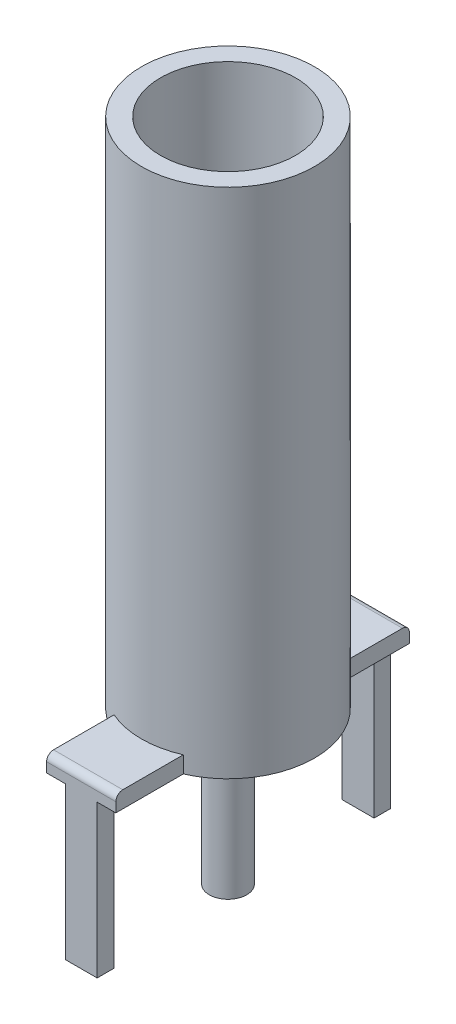
ISO-10303-21;
HEADER;
FILE_DESCRIPTION(('STEP AP214'),'2;1');
FILE_NAME('part.step','',(''),(''),'','','');
FILE_SCHEMA(('AUTOMOTIVE_DESIGN { 1 0 10303 214 1 1 1 1 }'));
ENDSEC;
DATA;
#1=APPLICATION_CONTEXT('core data for automotive mechanical design processes');
#2=APPLICATION_PROTOCOL_DEFINITION('international standard','automotive_design',2000,#1);
#3=PRODUCT_CONTEXT('',#1,'mechanical');
#4=PRODUCT('Part','Part','',(#3));
#5=PRODUCT_RELATED_PRODUCT_CATEGORY('part','',(#4));
#6=PRODUCT_DEFINITION_FORMATION('','',#4);
#7=PRODUCT_DEFINITION_CONTEXT('part definition',#1,'design');
#8=PRODUCT_DEFINITION('design','',#6,#7);
#9=PRODUCT_DEFINITION_SHAPE('','',#8);
#10=(LENGTH_UNIT() NAMED_UNIT(*) SI_UNIT(.MILLI.,.METRE.));
#11=(NAMED_UNIT(*) PLANE_ANGLE_UNIT() SI_UNIT($,.RADIAN.));
#12=(NAMED_UNIT(*) SI_UNIT($,.STERADIAN.) SOLID_ANGLE_UNIT());
#13=UNCERTAINTY_MEASURE_WITH_UNIT(LENGTH_MEASURE(1.E-05),#10,'distance_accuracy_value','');
#14=(GEOMETRIC_REPRESENTATION_CONTEXT(3) GLOBAL_UNCERTAINTY_ASSIGNED_CONTEXT((#13)) GLOBAL_UNIT_ASSIGNED_CONTEXT((#10,
#11,#12)) REPRESENTATION_CONTEXT('',''));
#15=CARTESIAN_POINT('',(0.,0.,0.));
#16=DIRECTION('',(0.,0.,1.));
#17=DIRECTION('',(1.,0.,0.));
#18=AXIS2_PLACEMENT_3D('',#15,#16,#17);
#19=CARTESIAN_POINT('',(0.,0.,0.));
#20=DIRECTION('',(0.,1.,0.));
#21=DIRECTION('',(0.,0.,1.));
#22=AXIS2_PLACEMENT_3D('',#19,#20,#21);
#23=PLANE('',#22);
#24=CARTESIAN_POINT('',(0.,0.,0.));
#25=DIRECTION('',(0.,1.,0.));
#26=DIRECTION('',(0.,0.,1.));
#27=AXIS2_PLACEMENT_3D('',#24,#25,#26);
#28=CIRCLE('',#27,0.3429);
#29=CARTESIAN_POINT('',(0.,0.,0.3429));
#30=VERTEX_POINT('',#29);
#31=EDGE_CURVE('E341',#30,#30,#28,.F.);
#32=ORIENTED_EDGE('',*,*,#31,.F.);
#33=EDGE_LOOP('',(#32));
#34=FACE_BOUND('',#33,.T.);
#35=DIRECTION('',(0.,0.,-1.));
#36=VECTOR('',#35,1.);
#37=CARTESIAN_POINT('',(-0.2921,0.,2.3876));
#38=LINE('',#37,#36);
#39=CARTESIAN_POINT('',(-0.2921,0.,2.6924));
#40=VERTEX_POINT('',#39);
#41=CARTESIAN_POINT('',(-0.2921,0.,2.3876));
#42=VERTEX_POINT('',#41);
#43=EDGE_CURVE('E227',#40,#42,#38,.T.);
#44=ORIENTED_EDGE('',*,*,#43,.F.);
#45=DIRECTION('',(-1.,0.,0.));
#46=VECTOR('',#45,1.);
#47=CARTESIAN_POINT('',(-0.635,0.,2.6924));
#48=LINE('',#47,#46);
#49=CARTESIAN_POINT('',(-0.635,0.,2.6924));
#50=VERTEX_POINT('',#49);
#51=EDGE_CURVE('E301',#40,#50,#48,.T.);
#52=ORIENTED_EDGE('',*,*,#51,.T.);
#53=DIRECTION('',(0.,0.,-1.));
#54=VECTOR('',#53,1.);
#55=CARTESIAN_POINT('',(-0.635,0.,2.6924));
#56=LINE('',#55,#54);
#57=CARTESIAN_POINT('',(-0.635,0.,1.45496778314848));
#58=VERTEX_POINT('',#57);
#59=EDGE_CURVE('E288',#50,#58,#56,.T.);
#60=ORIENTED_EDGE('',*,*,#59,.T.);
#61=CARTESIAN_POINT('',(0.,0.,0.));
#62=DIRECTION('',(0.,1.,0.));
#63=DIRECTION('',(0.,0.,1.));
#64=AXIS2_PLACEMENT_3D('',#61,#62,#63);
#65=CIRCLE('',#64,1.5875);
#66=CARTESIAN_POINT('',(-0.634999999999999,0.,-1.45496778314848));
#67=VERTEX_POINT('',#66);
#68=EDGE_CURVE('E336',#67,#58,#65,.T.);
#69=ORIENTED_EDGE('',*,*,#68,.F.);
#70=CARTESIAN_POINT('',(-0.634999999999999,0.,-2.6924));
#71=VERTEX_POINT('',#70);
#72=EDGE_CURVE('E278',#67,#71,#56,.T.);
#73=ORIENTED_EDGE('',*,*,#72,.T.);
#74=DIRECTION('',(1.,0.,0.));
#75=VECTOR('',#74,1.);
#76=CARTESIAN_POINT('',(-0.634999999999999,0.,-2.6924));
#77=LINE('',#76,#75);
#78=CARTESIAN_POINT('',(-0.2921,0.,-2.6924));
#79=VERTEX_POINT('',#78);
#80=EDGE_CURVE('E293',#71,#79,#77,.T.);
#81=ORIENTED_EDGE('',*,*,#80,.T.);
#82=DIRECTION('',(0.,0.,-1.));
#83=VECTOR('',#82,1.);
#84=CARTESIAN_POINT('',(-0.2921,0.,-2.3876));
#85=LINE('',#84,#83);
#86=CARTESIAN_POINT('',(-0.2921,0.,-2.3876));
#87=VERTEX_POINT('',#86);
#88=EDGE_CURVE('E229',#87,#79,#85,.T.);
#89=ORIENTED_EDGE('',*,*,#88,.F.);
#90=DIRECTION('',(-1.,0.,0.));
#91=VECTOR('',#90,1.);
#92=CARTESIAN_POINT('',(-0.2921,0.,-2.3876));
#93=LINE('',#92,#91);
#94=CARTESIAN_POINT('',(0.2921,0.,-2.3876));
#95=VERTEX_POINT('',#94);
#96=EDGE_CURVE('E247',#95,#87,#93,.T.);
#97=ORIENTED_EDGE('',*,*,#96,.F.);
#98=DIRECTION('',(0.,0.,1.));
#99=VECTOR('',#98,1.);
#100=CARTESIAN_POINT('',(0.2921,0.,-2.3876));
#101=LINE('',#100,#99);
#102=CARTESIAN_POINT('',(0.2921,0.,-2.6924));
#103=VERTEX_POINT('',#102);
#104=EDGE_CURVE('E235',#103,#95,#101,.T.);
#105=ORIENTED_EDGE('',*,*,#104,.F.);
#106=CARTESIAN_POINT('',(0.635000000000001,0.,-2.6924));
#107=VERTEX_POINT('',#106);
#108=EDGE_CURVE('E292',#103,#107,#77,.T.);
#109=ORIENTED_EDGE('',*,*,#108,.T.);
#110=DIRECTION('',(0.,0.,1.));
#111=VECTOR('',#110,1.);
#112=CARTESIAN_POINT('',(0.635000000000001,0.,2.6924));
#113=LINE('',#112,#111);
#114=CARTESIAN_POINT('',(0.635000000000001,0.,-1.45496778314848));
#115=VERTEX_POINT('',#114);
#116=EDGE_CURVE('E297',#107,#115,#113,.T.);
#117=ORIENTED_EDGE('',*,*,#116,.T.);
#118=CARTESIAN_POINT('',(0.635000000000001,0.,1.45496778314848));
#119=VERTEX_POINT('',#118);
#120=EDGE_CURVE('E342',#119,#115,#65,.T.);
#121=ORIENTED_EDGE('',*,*,#120,.F.);
#122=CARTESIAN_POINT('',(0.635000000000001,0.,2.6924));
#123=VERTEX_POINT('',#122);
#124=EDGE_CURVE('E296',#119,#123,#113,.T.);
#125=ORIENTED_EDGE('',*,*,#124,.T.);
#126=CARTESIAN_POINT('',(0.2921,0.,2.6924));
#127=VERTEX_POINT('',#126);
#128=EDGE_CURVE('E302',#123,#127,#48,.T.);
#129=ORIENTED_EDGE('',*,*,#128,.T.);
#130=DIRECTION('',(0.,0.,1.));
#131=VECTOR('',#130,1.);
#132=CARTESIAN_POINT('',(0.292100000000001,0.,2.3876));
#133=LINE('',#132,#131);
#134=CARTESIAN_POINT('',(0.292100000000001,0.,2.3876));
#135=VERTEX_POINT('',#134);
#136=EDGE_CURVE('E223',#135,#127,#133,.T.);
#137=ORIENTED_EDGE('',*,*,#136,.F.);
#138=DIRECTION('',(1.,0.,0.));
#139=VECTOR('',#138,1.);
#140=CARTESIAN_POINT('',(-0.2921,0.,2.3876));
#141=LINE('',#140,#139);
#142=EDGE_CURVE('E422',#42,#135,#141,.T.);
#143=ORIENTED_EDGE('',*,*,#142,.F.);
#144=EDGE_LOOP('',(#44,#52,#60,#69,#73,#81,#89,#97,#105,#109,#117,#121,#125,#129,#137,#143));
#145=FACE_BOUND('',#144,.T.);
#146=ADVANCED_FACE('F39',(#34,#145),#23,.F.);
#147=CARTESIAN_POINT('',(0.,9.398,0.));
#148=DIRECTION('',(0.,-1.,0.));
#149=DIRECTION('',(0.,0.,-1.));
#150=AXIS2_PLACEMENT_3D('',#147,#148,#149);
#151=CYLINDRICAL_SURFACE('',#150,1.5875);
#152=ORIENTED_EDGE('',*,*,#68,.T.);
#153=DIRECTION('',(0.,-1.,0.));
#154=VECTOR('',#153,1.);
#155=CARTESIAN_POINT('',(-0.635,9.398,1.45496778314848));
#156=LINE('',#155,#154);
#157=CARTESIAN_POINT('',(-0.635,0.304799999999999,1.45496778314848));
#158=VERTEX_POINT('',#157);
#159=EDGE_CURVE('E324',#58,#158,#156,.F.);
#160=ORIENTED_EDGE('',*,*,#159,.T.);
#161=CARTESIAN_POINT('',(0.,0.304799999999999,0.));
#162=DIRECTION('',(0.,-1.,0.));
#163=DIRECTION('',(0.,0.,-1.));
#164=AXIS2_PLACEMENT_3D('',#161,#162,#163);
#165=CIRCLE('',#164,1.5875);
#166=CARTESIAN_POINT('',(0.635000000000001,0.304799999999999,1.45496778314848));
#167=VERTEX_POINT('',#166);
#168=EDGE_CURVE('E352',#167,#158,#165,.T.);
#169=ORIENTED_EDGE('',*,*,#168,.F.);
#170=DIRECTION('',(0.,-1.,0.));
#171=VECTOR('',#170,1.);
#172=CARTESIAN_POINT('',(0.635000000000001,9.398,1.45496778314848));
#173=LINE('',#172,#171);
#174=EDGE_CURVE('E320',#167,#119,#173,.T.);
#175=ORIENTED_EDGE('',*,*,#174,.T.);
#176=ORIENTED_EDGE('',*,*,#120,.T.);
#177=DIRECTION('',(0.,-1.,0.));
#178=VECTOR('',#177,1.);
#179=CARTESIAN_POINT('',(0.635000000000001,9.398,-1.45496778314848));
#180=LINE('',#179,#178);
#181=CARTESIAN_POINT('',(0.635000000000001,0.304799999999999,-1.45496778314848));
#182=VERTEX_POINT('',#181);
#183=EDGE_CURVE('E308',#115,#182,#180,.F.);
#184=ORIENTED_EDGE('',*,*,#183,.T.);
#185=CARTESIAN_POINT('',(-0.634999999999999,0.304799999999999,-1.45496778314848));
#186=VERTEX_POINT('',#185);
#187=EDGE_CURVE('E348',#186,#182,#165,.T.);
#188=ORIENTED_EDGE('',*,*,#187,.F.);
#189=DIRECTION('',(0.,-1.,0.));
#190=VECTOR('',#189,1.);
#191=CARTESIAN_POINT('',(-0.634999999999999,9.398,-1.45496778314848));
#192=LINE('',#191,#190);
#193=EDGE_CURVE('E328',#186,#67,#192,.T.);
#194=ORIENTED_EDGE('',*,*,#193,.T.);
#195=EDGE_LOOP('',(#152,#160,#169,#175,#176,#184,#188,#194));
#196=FACE_BOUND('',#195,.T.);
#197=CARTESIAN_POINT('',(0.,9.398,0.));
#198=DIRECTION('',(0.,1.,0.));
#199=DIRECTION('',(0.,0.,1.));
#200=AXIS2_PLACEMENT_3D('',#197,#198,#199);
#201=CIRCLE('',#200,1.5875);
#202=CARTESIAN_POINT('',(0.,9.398,1.5875));
#203=VERTEX_POINT('',#202);
#204=EDGE_CURVE('E337',#203,#203,#201,.T.);
#205=ORIENTED_EDGE('',*,*,#204,.F.);
#206=EDGE_LOOP('',(#205));
#207=FACE_BOUND('',#206,.T.);
#208=ADVANCED_FACE('F392',(#196,#207),#151,.T.);
#209=CARTESIAN_POINT('',(0.,9.398,0.));
#210=DIRECTION('',(0.,1.,0.));
#211=DIRECTION('',(0.,0.,1.));
#212=AXIS2_PLACEMENT_3D('',#209,#210,#211);
#213=PLANE('',#212);
#214=CARTESIAN_POINT('',(0.,9.398,0.));
#215=DIRECTION('',(0.,1.,0.));
#216=DIRECTION('',(0.,0.,1.));
#217=AXIS2_PLACEMENT_3D('',#214,#215,#216);
#218=CIRCLE('',#217,1.23708348348289);
#219=CARTESIAN_POINT('',(0.,9.398,1.23708348348289));
#220=VERTEX_POINT('',#219);
#221=EDGE_CURVE('E374',#220,#220,#218,.T.);
#222=ORIENTED_EDGE('',*,*,#221,.F.);
#223=EDGE_LOOP('',(#222));
#224=FACE_BOUND('',#223,.T.);
#225=ORIENTED_EDGE('',*,*,#204,.T.);
#226=EDGE_LOOP('',(#225));
#227=FACE_BOUND('',#226,.T.);
#228=ADVANCED_FACE('F457',(#224,#227),#213,.T.);
#229=CARTESIAN_POINT('',(0.,-2.794,0.));
#230=DIRECTION('',(0.,1.,0.));
#231=DIRECTION('',(0.,0.,1.));
#232=AXIS2_PLACEMENT_3D('',#229,#230,#231);
#233=CYLINDRICAL_SURFACE('',#232,0.3429);
#234=CARTESIAN_POINT('',(0.,-2.794,0.));
#235=DIRECTION('',(0.,-1.,0.));
#236=DIRECTION('',(0.,0.,-1.));
#237=AXIS2_PLACEMENT_3D('',#234,#235,#236);
#238=CIRCLE('',#237,0.3429);
#239=CARTESIAN_POINT('',(0.,-2.794,-0.3429));
#240=VERTEX_POINT('',#239);
#241=EDGE_CURVE('E332',#240,#240,#238,.T.);
#242=ORIENTED_EDGE('',*,*,#241,.F.);
#243=EDGE_LOOP('',(#242));
#244=FACE_BOUND('',#243,.T.);
#245=ORIENTED_EDGE('',*,*,#31,.T.);
#246=EDGE_LOOP('',(#245));
#247=FACE_BOUND('',#246,.T.);
#248=ADVANCED_FACE('F519',(#244,#247),#233,.T.);
#249=CARTESIAN_POINT('',(0.,-2.794,0.));
#250=DIRECTION('',(0.,-1.,0.));
#251=DIRECTION('',(0.,0.,-1.));
#252=AXIS2_PLACEMENT_3D('',#249,#250,#251);
#253=PLANE('',#252);
#254=ORIENTED_EDGE('',*,*,#241,.T.);
#255=EDGE_LOOP('',(#254));
#256=FACE_BOUND('',#255,.T.);
#257=ADVANCED_FACE('F516',(#256),#253,.T.);
#258=CARTESIAN_POINT('',(-0.634999999999999,0.3048,-2.6924));
#259=DIRECTION('',(0.,0.,-1.));
#260=DIRECTION('',(-1.,0.,0.));
#261=AXIS2_PLACEMENT_3D('',#258,#259,#260);
#262=PLANE('',#261);
#263=DIRECTION('',(0.,-1.,0.));
#264=VECTOR('',#263,1.);
#265=CARTESIAN_POINT('',(-0.634999999999999,0.3048,-2.6924));
#266=LINE('',#265,#264);
#267=CARTESIAN_POINT('',(-0.634999999999999,0.1778,-2.6924));
#268=VERTEX_POINT('',#267);
#269=EDGE_CURVE('E287',#268,#71,#266,.T.);
#270=ORIENTED_EDGE('',*,*,#269,.F.);
#271=DIRECTION('',(1.,0.,0.));
#272=VECTOR('',#271,1.);
#273=CARTESIAN_POINT('',(0.635000000000001,0.1778,-2.6924));
#274=LINE('',#273,#272);
#275=CARTESIAN_POINT('',(0.635000000000001,0.1778,-2.6924));
#276=VERTEX_POINT('',#275);
#277=EDGE_CURVE('E353',#268,#276,#274,.T.);
#278=ORIENTED_EDGE('',*,*,#277,.T.);
#279=DIRECTION('',(0.,-1.,0.));
#280=VECTOR('',#279,1.);
#281=CARTESIAN_POINT('',(0.635000000000001,0.3048,-2.6924));
#282=LINE('',#281,#280);
#283=EDGE_CURVE('E312',#276,#107,#282,.T.);
#284=ORIENTED_EDGE('',*,*,#283,.T.);
#285=ORIENTED_EDGE('',*,*,#108,.F.);
#286=DIRECTION('',(0.,1.,0.));
#287=VECTOR('',#286,1.);
#288=CARTESIAN_POINT('',(0.2921,-2.794,-2.6924));
#289=LINE('',#288,#287);
#290=CARTESIAN_POINT('',(0.2921,-2.794,-2.6924));
#291=VERTEX_POINT('',#290);
#292=EDGE_CURVE('E270',#291,#103,#289,.T.);
#293=ORIENTED_EDGE('',*,*,#292,.F.);
#294=DIRECTION('',(1.,0.,0.));
#295=VECTOR('',#294,1.);
#296=CARTESIAN_POINT('',(-0.292099999999999,-2.794,-2.6924));
#297=LINE('',#296,#295);
#298=CARTESIAN_POINT('',(-0.292099999999999,-2.794,-2.6924));
#299=VERTEX_POINT('',#298);
#300=EDGE_CURVE('E246',#299,#291,#297,.T.);
#301=ORIENTED_EDGE('',*,*,#300,.F.);
#302=DIRECTION('',(0.,1.,0.));
#303=VECTOR('',#302,1.);
#304=CARTESIAN_POINT('',(-0.292099999999999,-2.794,-2.6924));
#305=LINE('',#304,#303);
#306=EDGE_CURVE('E274',#299,#79,#305,.T.);
#307=ORIENTED_EDGE('',*,*,#306,.T.);
#308=ORIENTED_EDGE('',*,*,#80,.F.);
#309=EDGE_LOOP('',(#270,#278,#284,#285,#293,#301,#307,#308));
#310=FACE_BOUND('',#309,.T.);
#311=ADVANCED_FACE('F449',(#310),#262,.T.);
#312=CARTESIAN_POINT('',(0.,0.3048,0.));
#313=DIRECTION('',(0.,-1.,0.));
#314=DIRECTION('',(0.,0.,-1.));
#315=AXIS2_PLACEMENT_3D('',#312,#313,#314);
#316=PLANE('',#315);
#317=DIRECTION('',(0.,0.,1.));
#318=VECTOR('',#317,1.);
#319=CARTESIAN_POINT('',(0.635000000000001,0.3048,2.6924));
#320=LINE('',#319,#318);
#321=CARTESIAN_POINT('',(0.635000000000001,0.3048,-2.5654));
#322=VERTEX_POINT('',#321);
#323=EDGE_CURVE('E284',#322,#182,#320,.T.);
#324=ORIENTED_EDGE('',*,*,#323,.F.);
#325=DIRECTION('',(1.,0.,0.));
#326=VECTOR('',#325,1.);
#327=CARTESIAN_POINT('',(-0.634999999999999,0.3048,-2.5654));
#328=LINE('',#327,#326);
#329=CARTESIAN_POINT('',(-0.634999999999999,0.3048,-2.5654));
#330=VERTEX_POINT('',#329);
#331=EDGE_CURVE('E360',#322,#330,#328,.F.);
#332=ORIENTED_EDGE('',*,*,#331,.T.);
#333=DIRECTION('',(0.,0.,-1.));
#334=VECTOR('',#333,1.);
#335=CARTESIAN_POINT('',(-0.635,0.3048,2.6924));
#336=LINE('',#335,#334);
#337=EDGE_CURVE('E283',#186,#330,#336,.T.);
#338=ORIENTED_EDGE('',*,*,#337,.F.);
#339=ORIENTED_EDGE('',*,*,#187,.T.);
#340=EDGE_LOOP('',(#324,#332,#338,#339));
#341=FACE_BOUND('',#340,.T.);
#342=ADVANCED_FACE('F438',(#341),#316,.F.);
#343=CARTESIAN_POINT('',(0.635000000000001,0.3048,2.6924));
#344=DIRECTION('',(1.,0.,0.));
#345=DIRECTION('',(0.,0.,-1.));
#346=AXIS2_PLACEMENT_3D('',#343,#344,#345);
#347=PLANE('',#346);
#348=ORIENTED_EDGE('',*,*,#283,.F.);
#349=CARTESIAN_POINT('',(0.635000000000001,0.1778,-2.5654));
#350=DIRECTION('',(1.,0.,0.));
#351=DIRECTION('',(0.,0.,-1.));
#352=AXIS2_PLACEMENT_3D('',#349,#350,#351);
#353=CIRCLE('',#352,0.127);
#354=EDGE_CURVE('E357',#276,#322,#353,.T.);
#355=ORIENTED_EDGE('',*,*,#354,.T.);
#356=ORIENTED_EDGE('',*,*,#323,.T.);
#357=ORIENTED_EDGE('',*,*,#183,.F.);
#358=ORIENTED_EDGE('',*,*,#116,.F.);
#359=EDGE_LOOP('',(#348,#355,#356,#357,#358));
#360=FACE_BOUND('',#359,.T.);
#361=ADVANCED_FACE('F444',(#360),#347,.T.);
#362=CARTESIAN_POINT('',(-0.635,0.3048,2.6924));
#363=DIRECTION('',(-1.,0.,0.));
#364=DIRECTION('',(0.,0.,1.));
#365=AXIS2_PLACEMENT_3D('',#362,#363,#364);
#366=PLANE('',#365);
#367=ORIENTED_EDGE('',*,*,#337,.T.);
#368=CARTESIAN_POINT('',(-0.634999999999999,0.1778,-2.5654));
#369=DIRECTION('',(-1.,0.,0.));
#370=DIRECTION('',(0.,0.,1.));
#371=AXIS2_PLACEMENT_3D('',#368,#369,#370);
#372=CIRCLE('',#371,0.127);
#373=EDGE_CURVE('E363',#330,#268,#372,.T.);
#374=ORIENTED_EDGE('',*,*,#373,.T.);
#375=ORIENTED_EDGE('',*,*,#269,.T.);
#376=ORIENTED_EDGE('',*,*,#72,.F.);
#377=ORIENTED_EDGE('',*,*,#193,.F.);
#378=EDGE_LOOP('',(#367,#374,#375,#376,#377));
#379=FACE_BOUND('',#378,.T.);
#380=ADVANCED_FACE('F436',(#379),#366,.T.);
#381=CARTESIAN_POINT('',(-0.635,0.3048,2.5654));
#382=VERTEX_POINT('',#381);
#383=EDGE_CURVE('E279',#382,#158,#336,.T.);
#384=ORIENTED_EDGE('',*,*,#383,.F.);
#385=DIRECTION('',(-1.,0.,0.));
#386=VECTOR('',#385,1.);
#387=CARTESIAN_POINT('',(0.635000000000001,0.3048,2.5654));
#388=LINE('',#387,#386);
#389=CARTESIAN_POINT('',(0.635000000000001,0.3048,2.5654));
#390=VERTEX_POINT('',#389);
#391=EDGE_CURVE('E48',#382,#390,#388,.F.);
#392=ORIENTED_EDGE('',*,*,#391,.T.);
#393=EDGE_CURVE('E282',#167,#390,#320,.T.);
#394=ORIENTED_EDGE('',*,*,#393,.F.);
#395=ORIENTED_EDGE('',*,*,#168,.T.);
#396=EDGE_LOOP('',(#384,#392,#394,#395));
#397=FACE_BOUND('',#396,.T.);
#398=ADVANCED_FACE('F434',(#397),#316,.F.);
#399=DIRECTION('',(0.,-1.,0.));
#400=VECTOR('',#399,1.);
#401=CARTESIAN_POINT('',(-0.635,0.3048,2.6924));
#402=LINE('',#401,#400);
#403=CARTESIAN_POINT('',(-0.635,0.1778,2.6924));
#404=VERTEX_POINT('',#403);
#405=EDGE_CURVE('E305',#404,#50,#402,.T.);
#406=ORIENTED_EDGE('',*,*,#405,.F.);
#407=CARTESIAN_POINT('',(-0.635,0.1778,2.5654));
#408=DIRECTION('',(-1.,0.,0.));
#409=DIRECTION('',(0.,0.,1.));
#410=AXIS2_PLACEMENT_3D('',#407,#408,#409);
#411=CIRCLE('',#410,0.127);
#412=EDGE_CURVE('E68',#404,#382,#411,.T.);
#413=ORIENTED_EDGE('',*,*,#412,.T.);
#414=ORIENTED_EDGE('',*,*,#383,.T.);
#415=ORIENTED_EDGE('',*,*,#159,.F.);
#416=ORIENTED_EDGE('',*,*,#59,.F.);
#417=EDGE_LOOP('',(#406,#413,#414,#415,#416));
#418=FACE_BOUND('',#417,.T.);
#419=ADVANCED_FACE('F398',(#418),#366,.T.);
#420=ORIENTED_EDGE('',*,*,#393,.T.);
#421=CARTESIAN_POINT('',(0.635000000000001,0.1778,2.5654));
#422=DIRECTION('',(1.,0.,0.));
#423=DIRECTION('',(0.,0.,-1.));
#424=AXIS2_PLACEMENT_3D('',#421,#422,#423);
#425=CIRCLE('',#424,0.127);
#426=CARTESIAN_POINT('',(0.635000000000001,0.1778,2.6924));
#427=VERTEX_POINT('',#426);
#428=EDGE_CURVE('E11',#390,#427,#425,.T.);
#429=ORIENTED_EDGE('',*,*,#428,.T.);
#430=DIRECTION('',(0.,-1.,0.));
#431=VECTOR('',#430,1.);
#432=CARTESIAN_POINT('',(0.635000000000001,0.3048,2.6924));
#433=LINE('',#432,#431);
#434=EDGE_CURVE('E309',#427,#123,#433,.T.);
#435=ORIENTED_EDGE('',*,*,#434,.T.);
#436=ORIENTED_EDGE('',*,*,#124,.F.);
#437=ORIENTED_EDGE('',*,*,#174,.F.);
#438=EDGE_LOOP('',(#420,#429,#435,#436,#437));
#439=FACE_BOUND('',#438,.T.);
#440=ADVANCED_FACE('F408',(#439),#347,.T.);
#441=CARTESIAN_POINT('',(-0.635,0.3048,2.6924));
#442=DIRECTION('',(0.,0.,1.));
#443=DIRECTION('',(1.,0.,0.));
#444=AXIS2_PLACEMENT_3D('',#441,#442,#443);
#445=PLANE('',#444);
#446=ORIENTED_EDGE('',*,*,#434,.F.);
#447=DIRECTION('',(-1.,0.,0.));
#448=VECTOR('',#447,1.);
#449=CARTESIAN_POINT('',(-0.635,0.1778,2.6924));
#450=LINE('',#449,#448);
#451=EDGE_CURVE('E366',#427,#404,#450,.T.);
#452=ORIENTED_EDGE('',*,*,#451,.T.);
#453=ORIENTED_EDGE('',*,*,#405,.T.);
#454=ORIENTED_EDGE('',*,*,#51,.F.);
#455=DIRECTION('',(0.,1.,0.));
#456=VECTOR('',#455,1.);
#457=CARTESIAN_POINT('',(-0.2921,-2.794,2.6924));
#458=LINE('',#457,#456);
#459=CARTESIAN_POINT('',(-0.2921,-2.794,2.6924));
#460=VERTEX_POINT('',#459);
#461=EDGE_CURVE('E402',#460,#40,#458,.T.);
#462=ORIENTED_EDGE('',*,*,#461,.F.);
#463=DIRECTION('',(-1.,0.,0.));
#464=VECTOR('',#463,1.);
#465=CARTESIAN_POINT('',(-0.2921,-2.794,2.6924));
#466=LINE('',#465,#464);
#467=CARTESIAN_POINT('',(0.292100000000001,-2.794,2.6924));
#468=VERTEX_POINT('',#467);
#469=EDGE_CURVE('E218',#468,#460,#466,.T.);
#470=ORIENTED_EDGE('',*,*,#469,.F.);
#471=DIRECTION('',(0.,1.,0.));
#472=VECTOR('',#471,1.);
#473=CARTESIAN_POINT('',(0.292100000000001,-2.794,2.6924));
#474=LINE('',#473,#472);
#475=EDGE_CURVE('E238',#468,#127,#474,.T.);
#476=ORIENTED_EDGE('',*,*,#475,.T.);
#477=ORIENTED_EDGE('',*,*,#128,.F.);
#478=EDGE_LOOP('',(#446,#452,#453,#454,#462,#470,#476,#477));
#479=FACE_BOUND('',#478,.T.);
#480=ADVANCED_FACE('F401',(#479),#445,.T.);
#481=CARTESIAN_POINT('',(-0.2921,-2.794,-2.3876));
#482=DIRECTION('',(1.,0.,0.));
#483=DIRECTION('',(0.,0.,-1.));
#484=AXIS2_PLACEMENT_3D('',#481,#482,#483);
#485=PLANE('',#484);
#486=ORIENTED_EDGE('',*,*,#88,.T.);
#487=ORIENTED_EDGE('',*,*,#306,.F.);
#488=DIRECTION('',(0.,0.,-1.));
#489=VECTOR('',#488,1.);
#490=CARTESIAN_POINT('',(-0.2921,-2.794,-2.3876));
#491=LINE('',#490,#489);
#492=CARTESIAN_POINT('',(-0.2921,-2.794,-2.3876));
#493=VERTEX_POINT('',#492);
#494=EDGE_CURVE('E242',#493,#299,#491,.T.);
#495=ORIENTED_EDGE('',*,*,#494,.F.);
#496=DIRECTION('',(0.,1.,0.));
#497=VECTOR('',#496,1.);
#498=CARTESIAN_POINT('',(-0.2921,-2.794,-2.3876));
#499=LINE('',#498,#497);
#500=EDGE_CURVE('E255',#493,#87,#499,.T.);
#501=ORIENTED_EDGE('',*,*,#500,.T.);
#502=EDGE_LOOP('',(#486,#487,#495,#501));
#503=FACE_BOUND('',#502,.T.);
#504=ADVANCED_FACE('F494',(#503),#485,.F.);
#505=CARTESIAN_POINT('',(0.2921,-2.794,-2.3876));
#506=DIRECTION('',(-1.,0.,0.));
#507=DIRECTION('',(0.,0.,1.));
#508=AXIS2_PLACEMENT_3D('',#505,#506,#507);
#509=PLANE('',#508);
#510=ORIENTED_EDGE('',*,*,#104,.T.);
#511=DIRECTION('',(0.,1.,0.));
#512=VECTOR('',#511,1.);
#513=CARTESIAN_POINT('',(0.2921,-2.794,-2.3876));
#514=LINE('',#513,#512);
#515=CARTESIAN_POINT('',(0.2921,-2.794,-2.3876));
#516=VERTEX_POINT('',#515);
#517=EDGE_CURVE('E266',#516,#95,#514,.T.);
#518=ORIENTED_EDGE('',*,*,#517,.F.);
#519=DIRECTION('',(0.,0.,1.));
#520=VECTOR('',#519,1.);
#521=CARTESIAN_POINT('',(0.2921,-2.794,-2.3876));
#522=LINE('',#521,#520);
#523=EDGE_CURVE('E250',#291,#516,#522,.T.);
#524=ORIENTED_EDGE('',*,*,#523,.F.);
#525=ORIENTED_EDGE('',*,*,#292,.T.);
#526=EDGE_LOOP('',(#510,#518,#524,#525));
#527=FACE_BOUND('',#526,.T.);
#528=ADVANCED_FACE('F487',(#527),#509,.F.);
#529=CARTESIAN_POINT('',(-0.2921,-2.794,-2.3876));
#530=DIRECTION('',(0.,0.,-1.));
#531=DIRECTION('',(-1.,0.,0.));
#532=AXIS2_PLACEMENT_3D('',#529,#530,#531);
#533=PLANE('',#532);
#534=ORIENTED_EDGE('',*,*,#96,.T.);
#535=ORIENTED_EDGE('',*,*,#500,.F.);
#536=DIRECTION('',(-1.,0.,0.));
#537=VECTOR('',#536,1.);
#538=CARTESIAN_POINT('',(-0.2921,-2.794,-2.3876));
#539=LINE('',#538,#537);
#540=EDGE_CURVE('E253',#516,#493,#539,.T.);
#541=ORIENTED_EDGE('',*,*,#540,.F.);
#542=ORIENTED_EDGE('',*,*,#517,.T.);
#543=EDGE_LOOP('',(#534,#535,#541,#542));
#544=FACE_BOUND('',#543,.T.);
#545=ADVANCED_FACE('F496',(#544),#533,.F.);
#546=CARTESIAN_POINT('',(0.,-2.794,0.));
#547=DIRECTION('',(0.,-1.,0.));
#548=DIRECTION('',(0.,0.,-1.));
#549=AXIS2_PLACEMENT_3D('',#546,#547,#548);
#550=PLANE('',#549);
#551=ORIENTED_EDGE('',*,*,#494,.T.);
#552=ORIENTED_EDGE('',*,*,#300,.T.);
#553=ORIENTED_EDGE('',*,*,#523,.T.);
#554=ORIENTED_EDGE('',*,*,#540,.T.);
#555=EDGE_LOOP('',(#551,#552,#553,#554));
#556=FACE_BOUND('',#555,.T.);
#557=ADVANCED_FACE('F490',(#556),#550,.T.);
#558=CARTESIAN_POINT('',(-0.2921,-2.794,2.3876));
#559=DIRECTION('',(1.,0.,0.));
#560=DIRECTION('',(0.,0.,-1.));
#561=AXIS2_PLACEMENT_3D('',#558,#559,#560);
#562=PLANE('',#561);
#563=ORIENTED_EDGE('',*,*,#43,.T.);
#564=DIRECTION('',(0.,1.,0.));
#565=VECTOR('',#564,1.);
#566=CARTESIAN_POINT('',(-0.2921,-2.794,2.3876));
#567=LINE('',#566,#565);
#568=CARTESIAN_POINT('',(-0.2921,-2.794,2.3876));
#569=VERTEX_POINT('',#568);
#570=EDGE_CURVE('E205',#569,#42,#567,.T.);
#571=ORIENTED_EDGE('',*,*,#570,.F.);
#572=DIRECTION('',(0.,0.,-1.));
#573=VECTOR('',#572,1.);
#574=CARTESIAN_POINT('',(-0.2921,-2.794,2.3876));
#575=LINE('',#574,#573);
#576=EDGE_CURVE('E213',#460,#569,#575,.T.);
#577=ORIENTED_EDGE('',*,*,#576,.F.);
#578=ORIENTED_EDGE('',*,*,#461,.T.);
#579=EDGE_LOOP('',(#563,#571,#577,#578));
#580=FACE_BOUND('',#579,.T.);
#581=ADVANCED_FACE('F225',(#580),#562,.F.);
#582=CARTESIAN_POINT('',(-0.2921,-2.794,2.3876));
#583=DIRECTION('',(0.,0.,1.));
#584=DIRECTION('',(1.,0.,0.));
#585=AXIS2_PLACEMENT_3D('',#582,#583,#584);
#586=PLANE('',#585);
#587=ORIENTED_EDGE('',*,*,#142,.T.);
#588=DIRECTION('',(0.,1.,0.));
#589=VECTOR('',#588,1.);
#590=CARTESIAN_POINT('',(0.292100000000001,-2.794,2.3876));
#591=LINE('',#590,#589);
#592=CARTESIAN_POINT('',(0.292100000000001,-2.794,2.3876));
#593=VERTEX_POINT('',#592);
#594=EDGE_CURVE('E208',#593,#135,#591,.T.);
#595=ORIENTED_EDGE('',*,*,#594,.F.);
#596=DIRECTION('',(1.,0.,0.));
#597=VECTOR('',#596,1.);
#598=CARTESIAN_POINT('',(-0.2921,-2.794,2.3876));
#599=LINE('',#598,#597);
#600=EDGE_CURVE('E200',#569,#593,#599,.T.);
#601=ORIENTED_EDGE('',*,*,#600,.F.);
#602=ORIENTED_EDGE('',*,*,#570,.T.);
#603=EDGE_LOOP('',(#587,#595,#601,#602));
#604=FACE_BOUND('',#603,.T.);
#605=ADVANCED_FACE('F203',(#604),#586,.F.);
#606=CARTESIAN_POINT('',(0.292100000000001,-2.794,2.3876));
#607=DIRECTION('',(-1.,0.,0.));
#608=DIRECTION('',(0.,0.,1.));
#609=AXIS2_PLACEMENT_3D('',#606,#607,#608);
#610=PLANE('',#609);
#611=ORIENTED_EDGE('',*,*,#136,.T.);
#612=ORIENTED_EDGE('',*,*,#475,.F.);
#613=DIRECTION('',(0.,0.,1.));
#614=VECTOR('',#613,1.);
#615=CARTESIAN_POINT('',(0.292100000000001,-2.794,2.3876));
#616=LINE('',#615,#614);
#617=EDGE_CURVE('E212',#593,#468,#616,.T.);
#618=ORIENTED_EDGE('',*,*,#617,.F.);
#619=ORIENTED_EDGE('',*,*,#594,.T.);
#620=EDGE_LOOP('',(#611,#612,#618,#619));
#621=FACE_BOUND('',#620,.T.);
#622=ADVANCED_FACE('F431',(#621),#610,.F.);
#623=CARTESIAN_POINT('',(0.,-2.794,0.));
#624=DIRECTION('',(0.,1.,0.));
#625=DIRECTION('',(0.,0.,1.));
#626=AXIS2_PLACEMENT_3D('',#623,#624,#625);
#627=PLANE('',#626);
#628=ORIENTED_EDGE('',*,*,#576,.T.);
#629=ORIENTED_EDGE('',*,*,#600,.T.);
#630=ORIENTED_EDGE('',*,*,#617,.T.);
#631=ORIENTED_EDGE('',*,*,#469,.T.);
#632=EDGE_LOOP('',(#628,#629,#630,#631));
#633=FACE_BOUND('',#632,.T.);
#634=ADVANCED_FACE('F216',(#633),#627,.F.);
#635=CARTESIAN_POINT('',(-0.634999999999999,0.1778,-2.5654));
#636=DIRECTION('',(-1.,0.,0.));
#637=DIRECTION('',(0.,0.,1.));
#638=AXIS2_PLACEMENT_3D('',#635,#636,#637);
#639=CYLINDRICAL_SURFACE('',#638,0.127);
#640=ORIENTED_EDGE('',*,*,#373,.F.);
#641=ORIENTED_EDGE('',*,*,#331,.F.);
#642=ORIENTED_EDGE('',*,*,#354,.F.);
#643=ORIENTED_EDGE('',*,*,#277,.F.);
#644=EDGE_LOOP('',(#640,#641,#642,#643));
#645=FACE_BOUND('',#644,.T.);
#646=ADVANCED_FACE('F462',(#645),#639,.T.);
#647=CARTESIAN_POINT('',(-0.635,0.1778,2.5654));
#648=DIRECTION('',(1.,0.,0.));
#649=DIRECTION('',(0.,0.,-1.));
#650=AXIS2_PLACEMENT_3D('',#647,#648,#649);
#651=CYLINDRICAL_SURFACE('',#650,0.127);
#652=ORIENTED_EDGE('',*,*,#428,.F.);
#653=ORIENTED_EDGE('',*,*,#391,.F.);
#654=ORIENTED_EDGE('',*,*,#412,.F.);
#655=ORIENTED_EDGE('',*,*,#451,.F.);
#656=EDGE_LOOP('',(#652,#653,#654,#655));
#657=FACE_BOUND('',#656,.T.);
#658=ADVANCED_FACE('F41',(#657),#651,.T.);
#659=CARTESIAN_POINT('',(0.,1.524,0.));
#660=DIRECTION('',(0.,1.,0.));
#661=DIRECTION('',(0.,0.,1.));
#662=AXIS2_PLACEMENT_3D('',#659,#660,#661);
#663=CYLINDRICAL_SURFACE('',#662,1.23708348348289);
#664=CARTESIAN_POINT('',(0.,1.524,0.));
#665=DIRECTION('',(0.,1.,0.));
#666=DIRECTION('',(0.,0.,1.));
#667=AXIS2_PLACEMENT_3D('',#664,#665,#666);
#668=CIRCLE('',#667,1.23708348348289);
#669=CARTESIAN_POINT('',(0.,1.524,1.23708348348289));
#670=VERTEX_POINT('',#669);
#671=EDGE_CURVE('E377',#670,#670,#668,.T.);
#672=ORIENTED_EDGE('',*,*,#671,.F.);
#673=EDGE_LOOP('',(#672));
#674=FACE_BOUND('',#673,.T.);
#675=ORIENTED_EDGE('',*,*,#221,.T.);
#676=EDGE_LOOP('',(#675));
#677=FACE_BOUND('',#676,.T.);
#678=ADVANCED_FACE('F469',(#674,#677),#663,.F.);
#679=CARTESIAN_POINT('',(0.,1.524,0.));
#680=DIRECTION('',(0.,1.,0.));
#681=DIRECTION('',(0.,0.,1.));
#682=AXIS2_PLACEMENT_3D('',#679,#680,#681);
#683=PLANE('',#682);
#684=ORIENTED_EDGE('',*,*,#671,.T.);
#685=EDGE_LOOP('',(#684));
#686=FACE_BOUND('',#685,.T.);
#687=ADVANCED_FACE('F536',(#686),#683,.T.);
#688=CLOSED_SHELL('',(#146,#208,#228,#248,#257,#311,#342,#361,#380,#398,#419,#440,#480,#504,
#528,#545,#557,#581,#605,#622,#634,#646,#658,#678,#687));
#689=MANIFOLD_SOLID_BREP('B2',#688);
#690=ADVANCED_BREP_SHAPE_REPRESENTATION('',(#18,#689),#14);
#691=SHAPE_DEFINITION_REPRESENTATION(#9,#690);
ENDSEC;
END-ISO-10303-21;
